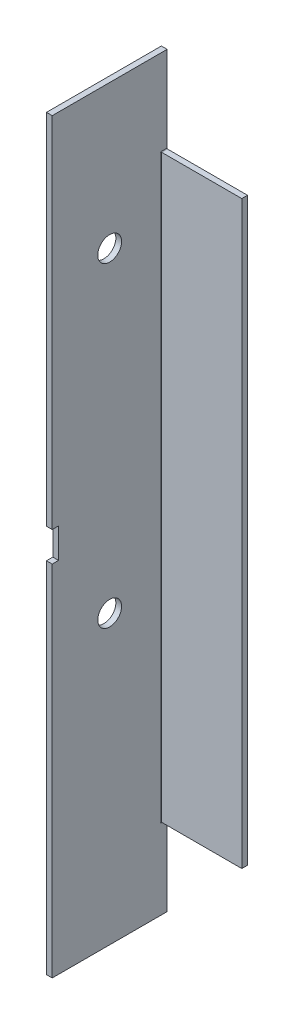
ISO-10303-21;
HEADER;
FILE_DESCRIPTION(('STEP AP214'),'2;1');
FILE_NAME('part.step','',(''),(''),'','','');
FILE_SCHEMA(('AUTOMOTIVE_DESIGN { 1 0 10303 214 1 1 1 1 }'));
ENDSEC;
DATA;
#1=APPLICATION_CONTEXT('core data for automotive mechanical design processes');
#2=APPLICATION_PROTOCOL_DEFINITION('international standard','automotive_design',2000,#1);
#3=PRODUCT_CONTEXT('',#1,'mechanical');
#4=PRODUCT('Part','Part','',(#3));
#5=PRODUCT_RELATED_PRODUCT_CATEGORY('part','',(#4));
#6=PRODUCT_DEFINITION_FORMATION('','',#4);
#7=PRODUCT_DEFINITION_CONTEXT('part definition',#1,'design');
#8=PRODUCT_DEFINITION('design','',#6,#7);
#9=PRODUCT_DEFINITION_SHAPE('','',#8);
#10=(LENGTH_UNIT() NAMED_UNIT(*) SI_UNIT(.MILLI.,.METRE.));
#11=(NAMED_UNIT(*) PLANE_ANGLE_UNIT() SI_UNIT($,.RADIAN.));
#12=(NAMED_UNIT(*) SI_UNIT($,.STERADIAN.) SOLID_ANGLE_UNIT());
#13=UNCERTAINTY_MEASURE_WITH_UNIT(LENGTH_MEASURE(1.E-05),#10,'distance_accuracy_value','');
#14=(GEOMETRIC_REPRESENTATION_CONTEXT(3) GLOBAL_UNCERTAINTY_ASSIGNED_CONTEXT((#13)) GLOBAL_UNIT_ASSIGNED_CONTEXT((#10,
#11,#12)) REPRESENTATION_CONTEXT('',''));
#15=CARTESIAN_POINT('',(0.,0.,0.));
#16=DIRECTION('',(0.,0.,1.));
#17=DIRECTION('',(1.,0.,0.));
#18=AXIS2_PLACEMENT_3D('',#15,#16,#17);
#19=CARTESIAN_POINT('',(-470.,150.,1307.83530989849));
#20=DIRECTION('',(1.,0.,0.));
#21=DIRECTION('',(0.,0.,-1.));
#22=AXIS2_PLACEMENT_3D('',#19,#20,#21);
#23=PLANE('',#22);
#24=DIRECTION('',(0.,-1.,0.));
#25=VECTOR('',#24,1.);
#26=CARTESIAN_POINT('',(-470.,150.,900.));
#27=LINE('',#26,#25);
#28=CARTESIAN_POINT('',(-470.,150.,900.));
#29=VERTEX_POINT('',#28);
#30=CARTESIAN_POINT('',(-470.,-52.0000000000001,900.));
#31=VERTEX_POINT('',#30);
#32=EDGE_CURVE('E232',#29,#31,#27,.T.);
#33=ORIENTED_EDGE('',*,*,#32,.F.);
#34=DIRECTION('',(0.,0.,-1.));
#35=VECTOR('',#34,1.);
#36=CARTESIAN_POINT('',(-470.,150.,1307.83530989849));
#37=LINE('',#36,#35);
#38=CARTESIAN_POINT('',(-470.,150.,902.));
#39=VERTEX_POINT('',#38);
#40=EDGE_CURVE('E12',#39,#29,#37,.T.);
#41=ORIENTED_EDGE('',*,*,#40,.F.);
#42=DIRECTION('',(0.,-1.,0.));
#43=VECTOR('',#42,1.);
#44=CARTESIAN_POINT('',(-470.,150.,902.));
#45=LINE('',#44,#43);
#46=CARTESIAN_POINT('',(-470.,-52.0000000000001,902.));
#47=VERTEX_POINT('',#46);
#48=EDGE_CURVE('E68',#39,#47,#45,.T.);
#49=ORIENTED_EDGE('',*,*,#48,.T.);
#50=DIRECTION('',(0.,0.,-1.));
#51=VECTOR('',#50,1.);
#52=CARTESIAN_POINT('',(-470.,-52.0000000000001,1307.83530989849));
#53=LINE('',#52,#51);
#54=EDGE_CURVE('E596',#47,#31,#53,.T.);
#55=ORIENTED_EDGE('',*,*,#54,.T.);
#56=EDGE_LOOP('',(#33,#41,#49,#55));
#57=FACE_BOUND('',#56,.T.);
#58=ADVANCED_FACE('F47',(#57),#23,.T.);
#59=CARTESIAN_POINT('',(-470.,-52.0000000000001,1307.83530989849));
#60=DIRECTION('',(0.,-1.,0.));
#61=DIRECTION('',(1.,0.,0.));
#62=AXIS2_PLACEMENT_3D('',#59,#60,#61);
#63=PLANE('',#62);
#64=DIRECTION('',(-1.,0.,0.));
#65=VECTOR('',#64,1.);
#66=CARTESIAN_POINT('',(-470.,-52.0000000000001,900.));
#67=LINE('',#66,#65);
#68=CARTESIAN_POINT('',(-497.9,-52.0000000000001,900.));
#69=VERTEX_POINT('',#68);
#70=EDGE_CURVE('E89',#31,#69,#67,.T.);
#71=ORIENTED_EDGE('',*,*,#70,.F.);
#72=ORIENTED_EDGE('',*,*,#54,.F.);
#73=DIRECTION('',(-1.,0.,0.));
#74=VECTOR('',#73,1.);
#75=CARTESIAN_POINT('',(-470.,-52.0000000000001,902.));
#76=LINE('',#75,#74);
#77=CARTESIAN_POINT('',(-497.9,-52.0000000000001,902.));
#78=VERTEX_POINT('',#77);
#79=EDGE_CURVE('E226',#47,#78,#76,.T.);
#80=ORIENTED_EDGE('',*,*,#79,.T.);
#81=DIRECTION('',(0.,0.,-1.));
#82=VECTOR('',#81,1.);
#83=CARTESIAN_POINT('',(-497.9,-52.0000000000001,1307.83530989849));
#84=LINE('',#83,#82);
#85=EDGE_CURVE('E217',#78,#69,#84,.T.);
#86=ORIENTED_EDGE('',*,*,#85,.T.);
#87=EDGE_LOOP('',(#71,#72,#80,#86));
#88=FACE_BOUND('',#87,.T.);
#89=ADVANCED_FACE('F225',(#88),#63,.T.);
#90=CARTESIAN_POINT('',(-500.,150.,900.));
#91=DIRECTION('',(0.,0.,1.));
#92=DIRECTION('',(1.,0.,0.));
#93=AXIS2_PLACEMENT_3D('',#90,#91,#92);
#94=PLANE('',#93);
#95=ORIENTED_EDGE('',*,*,#70,.T.);
#96=DIRECTION('',(0.,1.,0.));
#97=VECTOR('',#96,1.);
#98=CARTESIAN_POINT('',(-497.9,-52.0000000000001,900.));
#99=LINE('',#98,#97);
#100=CARTESIAN_POINT('',(-497.9,150.,900.));
#101=VERTEX_POINT('',#100);
#102=EDGE_CURVE('E204',#69,#101,#99,.T.);
#103=ORIENTED_EDGE('',*,*,#102,.T.);
#104=DIRECTION('',(1.,0.,0.));
#105=VECTOR('',#104,1.);
#106=CARTESIAN_POINT('',(-500.,150.,900.));
#107=LINE('',#106,#105);
#108=EDGE_CURVE('E213',#101,#29,#107,.T.);
#109=ORIENTED_EDGE('',*,*,#108,.T.);
#110=ORIENTED_EDGE('',*,*,#32,.T.);
#111=EDGE_LOOP('',(#95,#103,#109,#110));
#112=FACE_BOUND('',#111,.T.);
#113=ADVANCED_FACE('F230',(#112),#94,.F.);
#114=CARTESIAN_POINT('',(-500.,150.,1307.83530989849));
#115=DIRECTION('',(0.,1.,0.));
#116=DIRECTION('',(-1.,0.,0.));
#117=AXIS2_PLACEMENT_3D('',#114,#115,#116);
#118=PLANE('',#117);
#119=ORIENTED_EDGE('',*,*,#108,.F.);
#120=DIRECTION('',(0.,0.,-1.));
#121=VECTOR('',#120,1.);
#122=CARTESIAN_POINT('',(-497.9,150.,1307.83530989849));
#123=LINE('',#122,#121);
#124=CARTESIAN_POINT('',(-497.9,150.,902.));
#125=VERTEX_POINT('',#124);
#126=EDGE_CURVE('E522',#125,#101,#123,.T.);
#127=ORIENTED_EDGE('',*,*,#126,.F.);
#128=DIRECTION('',(1.,0.,0.));
#129=VECTOR('',#128,1.);
#130=CARTESIAN_POINT('',(-500.,150.,902.));
#131=LINE('',#130,#129);
#132=EDGE_CURVE('E59',#125,#39,#131,.T.);
#133=ORIENTED_EDGE('',*,*,#132,.T.);
#134=ORIENTED_EDGE('',*,*,#40,.T.);
#135=EDGE_LOOP('',(#119,#127,#133,#134));
#136=FACE_BOUND('',#135,.T.);
#137=ADVANCED_FACE('F589',(#136),#118,.T.);
#138=CARTESIAN_POINT('',(-500.,150.,902.));
#139=DIRECTION('',(0.,0.,1.));
#140=DIRECTION('',(1.,0.,0.));
#141=AXIS2_PLACEMENT_3D('',#138,#139,#140);
#142=PLANE('',#141);
#143=DIRECTION('',(0.,1.,0.));
#144=VECTOR('',#143,1.);
#145=CARTESIAN_POINT('',(-497.9,-52.0000000000001,902.));
#146=LINE('',#145,#144);
#147=EDGE_CURVE('E51',#78,#125,#146,.T.);
#148=ORIENTED_EDGE('',*,*,#147,.F.);
#149=ORIENTED_EDGE('',*,*,#79,.F.);
#150=ORIENTED_EDGE('',*,*,#48,.F.);
#151=ORIENTED_EDGE('',*,*,#132,.F.);
#152=EDGE_LOOP('',(#148,#149,#150,#151));
#153=FACE_BOUND('',#152,.T.);
#154=ADVANCED_FACE('F49',(#153),#142,.T.);
#155=CARTESIAN_POINT('',(-500.,180.,940.));
#156=DIRECTION('',(1.,0.,0.));
#157=DIRECTION('',(0.,0.,-1.));
#158=AXIS2_PLACEMENT_3D('',#155,#156,#157);
#159=PLANE('',#158);
#160=CARTESIAN_POINT('',(-500.,20.,920.));
#161=DIRECTION('',(1.,0.,0.));
#162=DIRECTION('',(0.,0.,-1.));
#163=AXIS2_PLACEMENT_3D('',#160,#161,#162);
#164=CIRCLE('',#163,4.15);
#165=CARTESIAN_POINT('',(-500.,20.,915.85));
#166=VERTEX_POINT('',#165);
#167=EDGE_CURVE('E356',#166,#166,#164,.F.);
#168=ORIENTED_EDGE('',*,*,#167,.F.);
#169=EDGE_LOOP('',(#168));
#170=FACE_BOUND('',#169,.T.);
#171=CARTESIAN_POINT('',(-500.,130.,920.));
#172=DIRECTION('',(1.,0.,0.));
#173=DIRECTION('',(0.,0.,-1.));
#174=AXIS2_PLACEMENT_3D('',#171,#172,#173);
#175=CIRCLE('',#174,4.15);
#176=CARTESIAN_POINT('',(-500.,130.,915.85));
#177=VERTEX_POINT('',#176);
#178=EDGE_CURVE('E363',#177,#177,#175,.F.);
#179=ORIENTED_EDGE('',*,*,#178,.F.);
#180=EDGE_LOOP('',(#179));
#181=FACE_BOUND('',#180,.T.);
#182=DIRECTION('',(0.,1.,0.));
#183=VECTOR('',#182,1.);
#184=CARTESIAN_POINT('',(-500.,-52.0000000000001,902.1));
#185=LINE('',#184,#183);
#186=CARTESIAN_POINT('',(-500.,-52.0000000000001,902.1));
#187=VERTEX_POINT('',#186);
#188=CARTESIAN_POINT('',(-500.,150.,902.1));
#189=VERTEX_POINT('',#188);
#190=EDGE_CURVE('E314',#187,#189,#185,.T.);
#191=ORIENTED_EDGE('',*,*,#190,.F.);
#192=DIRECTION('',(0.,0.,-1.));
#193=VECTOR('',#192,1.);
#194=CARTESIAN_POINT('',(-500.,-52.,940.000000000001));
#195=LINE('',#194,#193);
#196=CARTESIAN_POINT('',(-500.,-52.0000000000001,902.3));
#197=VERTEX_POINT('',#196);
#198=EDGE_CURVE('E372',#197,#187,#195,.T.);
#199=ORIENTED_EDGE('',*,*,#198,.F.);
#200=DIRECTION('',(0.,1.,0.));
#201=VECTOR('',#200,1.);
#202=CARTESIAN_POINT('',(-500.,180.,902.299999999999));
#203=LINE('',#202,#201);
#204=CARTESIAN_POINT('',(-500.,-52.2000000000001,902.3));
#205=VERTEX_POINT('',#204);
#206=EDGE_CURVE('E455',#205,#197,#203,.T.);
#207=ORIENTED_EDGE('',*,*,#206,.F.);
#208=DIRECTION('',(0.,0.,1.));
#209=VECTOR('',#208,1.);
#210=CARTESIAN_POINT('',(-500.,-52.2,940.000000000001));
#211=LINE('',#210,#209);
#212=CARTESIAN_POINT('',(-500.,-52.2000000000001,900.));
#213=VERTEX_POINT('',#212);
#214=EDGE_CURVE('E450',#213,#205,#211,.T.);
#215=ORIENTED_EDGE('',*,*,#214,.F.);
#216=DIRECTION('',(0.,1.,0.));
#217=VECTOR('',#216,1.);
#218=CARTESIAN_POINT('',(-500.,150.,900.));
#219=LINE('',#218,#217);
#220=CARTESIAN_POINT('',(-500.,-80.,899.999999999977));
#221=VERTEX_POINT('',#220);
#222=EDGE_CURVE('E454',#221,#213,#219,.T.);
#223=ORIENTED_EDGE('',*,*,#222,.F.);
#224=DIRECTION('',(0.,0.,-1.));
#225=VECTOR('',#224,1.);
#226=CARTESIAN_POINT('',(-500.,-80.0000000000001,940.));
#227=LINE('',#226,#225);
#228=CARTESIAN_POINT('',(-500.,-80.,940.));
#229=VERTEX_POINT('',#228);
#230=EDGE_CURVE('E459',#229,#221,#227,.T.);
#231=ORIENTED_EDGE('',*,*,#230,.F.);
#232=DIRECTION('',(0.,-1.,0.));
#233=VECTOR('',#232,1.);
#234=CARTESIAN_POINT('',(-500.,180.,940.));
#235=LINE('',#234,#233);
#236=CARTESIAN_POINT('',(-500.,44.8,940.));
#237=VERTEX_POINT('',#236);
#238=EDGE_CURVE('E473',#237,#229,#235,.T.);
#239=ORIENTED_EDGE('',*,*,#238,.F.);
#240=DIRECTION('',(0.,0.,-1.));
#241=VECTOR('',#240,1.);
#242=CARTESIAN_POINT('',(-500.,44.8,940.2));
#243=LINE('',#242,#241);
#244=CARTESIAN_POINT('',(-500.,44.8,937.8));
#245=VERTEX_POINT('',#244);
#246=EDGE_CURVE('E477',#237,#245,#243,.T.);
#247=ORIENTED_EDGE('',*,*,#246,.T.);
#248=DIRECTION('',(0.,-1.,0.));
#249=VECTOR('',#248,1.);
#250=CARTESIAN_POINT('',(-500.,44.8,937.8));
#251=LINE('',#250,#249);
#252=CARTESIAN_POINT('',(-500.,55.2,937.8));
#253=VERTEX_POINT('',#252);
#254=EDGE_CURVE('E547',#253,#245,#251,.T.);
#255=ORIENTED_EDGE('',*,*,#254,.F.);
#256=DIRECTION('',(0.,0.,-1.));
#257=VECTOR('',#256,1.);
#258=CARTESIAN_POINT('',(-500.,55.2,940.2));
#259=LINE('',#258,#257);
#260=CARTESIAN_POINT('',(-500.,55.2,940.));
#261=VERTEX_POINT('',#260);
#262=EDGE_CURVE('E493',#261,#253,#259,.T.);
#263=ORIENTED_EDGE('',*,*,#262,.F.);
#264=CARTESIAN_POINT('',(-500.,180.,940.));
#265=VERTEX_POINT('',#264);
#266=EDGE_CURVE('E478',#265,#261,#235,.T.);
#267=ORIENTED_EDGE('',*,*,#266,.F.);
#268=DIRECTION('',(0.,0.,1.));
#269=VECTOR('',#268,1.);
#270=CARTESIAN_POINT('',(-500.,180.,940.));
#271=LINE('',#270,#269);
#272=CARTESIAN_POINT('',(-500.,180.,900.));
#273=VERTEX_POINT('',#272);
#274=EDGE_CURVE('E488',#273,#265,#271,.T.);
#275=ORIENTED_EDGE('',*,*,#274,.F.);
#276=CARTESIAN_POINT('',(-500.,150.2,900.));
#277=VERTEX_POINT('',#276);
#278=EDGE_CURVE('E373',#277,#273,#219,.T.);
#279=ORIENTED_EDGE('',*,*,#278,.F.);
#280=DIRECTION('',(0.,0.,-1.));
#281=VECTOR('',#280,1.);
#282=CARTESIAN_POINT('',(-500.,150.2,940.));
#283=LINE('',#282,#281);
#284=CARTESIAN_POINT('',(-500.,150.2,902.3));
#285=VERTEX_POINT('',#284);
#286=EDGE_CURVE('E495',#285,#277,#283,.T.);
#287=ORIENTED_EDGE('',*,*,#286,.F.);
#288=DIRECTION('',(0.,1.,0.));
#289=VECTOR('',#288,1.);
#290=CARTESIAN_POINT('',(-500.,180.,902.3));
#291=LINE('',#290,#289);
#292=CARTESIAN_POINT('',(-500.,150.,902.3));
#293=VERTEX_POINT('',#292);
#294=EDGE_CURVE('E499',#293,#285,#291,.T.);
#295=ORIENTED_EDGE('',*,*,#294,.F.);
#296=DIRECTION('',(0.,0.,1.));
#297=VECTOR('',#296,1.);
#298=CARTESIAN_POINT('',(-500.,150.,940.));
#299=LINE('',#298,#297);
#300=EDGE_CURVE('E367',#189,#293,#299,.T.);
#301=ORIENTED_EDGE('',*,*,#300,.F.);
#302=EDGE_LOOP('',(#191,#199,#207,#215,#223,#231,#239,#247,#255,#263,#267,#275,#279,#287,#295,#301));
#303=FACE_BOUND('',#302,.T.);
#304=ADVANCED_FACE('F515',(#170,#181,#303),#159,.F.);
#305=CARTESIAN_POINT('',(-498.,-178.,-49.114696339176));
#306=DIRECTION('',(1.,0.,0.));
#307=DIRECTION('',(0.,0.,-1.));
#308=AXIS2_PLACEMENT_3D('',#305,#306,#307);
#309=PLANE('',#308);
#310=CARTESIAN_POINT('',(-498.,20.,920.));
#311=DIRECTION('',(1.,0.,0.));
#312=DIRECTION('',(0.,0.,-1.));
#313=AXIS2_PLACEMENT_3D('',#310,#311,#312);
#314=CIRCLE('',#313,4.15);
#315=CARTESIAN_POINT('',(-498.,20.,915.85));
#316=VERTEX_POINT('',#315);
#317=EDGE_CURVE('E336',#316,#316,#314,.T.);
#318=ORIENTED_EDGE('',*,*,#317,.F.);
#319=EDGE_LOOP('',(#318));
#320=FACE_BOUND('',#319,.T.);
#321=CARTESIAN_POINT('',(-498.,130.,920.));
#322=DIRECTION('',(1.,0.,0.));
#323=DIRECTION('',(0.,0.,-1.));
#324=AXIS2_PLACEMENT_3D('',#321,#322,#323);
#325=CIRCLE('',#324,4.15);
#326=CARTESIAN_POINT('',(-498.,130.,915.85));
#327=VERTEX_POINT('',#326);
#328=EDGE_CURVE('E341',#327,#327,#325,.T.);
#329=ORIENTED_EDGE('',*,*,#328,.F.);
#330=EDGE_LOOP('',(#329));
#331=FACE_BOUND('',#330,.T.);
#332=DIRECTION('',(0.,0.,-1.));
#333=VECTOR('',#332,1.);
#334=CARTESIAN_POINT('',(-498.,-52.0000000000034,-49.1146963391765));
#335=LINE('',#334,#333);
#336=CARTESIAN_POINT('',(-498.,-52.0000000000001,902.3));
#337=VERTEX_POINT('',#336);
#338=CARTESIAN_POINT('',(-498.,-52.0000000000001,902.1));
#339=VERTEX_POINT('',#338);
#340=EDGE_CURVE('E351',#337,#339,#335,.T.);
#341=ORIENTED_EDGE('',*,*,#340,.T.);
#342=DIRECTION('',(0.,1.,0.));
#343=VECTOR('',#342,1.);
#344=CARTESIAN_POINT('',(-498.,-52.0000000000001,902.1));
#345=LINE('',#344,#343);
#346=CARTESIAN_POINT('',(-498.,150.,902.1));
#347=VERTEX_POINT('',#346);
#348=EDGE_CURVE('E318',#339,#347,#345,.T.);
#349=ORIENTED_EDGE('',*,*,#348,.T.);
#350=DIRECTION('',(0.,0.,1.));
#351=VECTOR('',#350,1.);
#352=CARTESIAN_POINT('',(-498.,150.,-49.114696339176));
#353=LINE('',#352,#351);
#354=CARTESIAN_POINT('',(-498.,150.,902.3));
#355=VERTEX_POINT('',#354);
#356=EDGE_CURVE('E382',#347,#355,#353,.T.);
#357=ORIENTED_EDGE('',*,*,#356,.T.);
#358=DIRECTION('',(0.,1.,0.));
#359=VECTOR('',#358,1.);
#360=CARTESIAN_POINT('',(-498.,-178.,902.3));
#361=LINE('',#360,#359);
#362=CARTESIAN_POINT('',(-498.,150.2,902.3));
#363=VERTEX_POINT('',#362);
#364=EDGE_CURVE('E97',#355,#363,#361,.T.);
#365=ORIENTED_EDGE('',*,*,#364,.T.);
#366=DIRECTION('',(0.,0.,-1.));
#367=VECTOR('',#366,1.);
#368=CARTESIAN_POINT('',(-498.,150.2,-49.114696339176));
#369=LINE('',#368,#367);
#370=CARTESIAN_POINT('',(-498.,150.2,900.));
#371=VERTEX_POINT('',#370);
#372=EDGE_CURVE('E105',#363,#371,#369,.T.);
#373=ORIENTED_EDGE('',*,*,#372,.T.);
#374=DIRECTION('',(0.,1.,0.));
#375=VECTOR('',#374,1.);
#376=CARTESIAN_POINT('',(-498.,150.,900.));
#377=LINE('',#376,#375);
#378=CARTESIAN_POINT('',(-498.,180.,900.));
#379=VERTEX_POINT('',#378);
#380=EDGE_CURVE('E392',#371,#379,#377,.T.);
#381=ORIENTED_EDGE('',*,*,#380,.T.);
#382=DIRECTION('',(0.,0.,1.));
#383=VECTOR('',#382,1.);
#384=CARTESIAN_POINT('',(-498.,180.,0.));
#385=LINE('',#384,#383);
#386=CARTESIAN_POINT('',(-498.,180.,940.));
#387=VERTEX_POINT('',#386);
#388=EDGE_CURVE('E400',#379,#387,#385,.T.);
#389=ORIENTED_EDGE('',*,*,#388,.T.);
#390=DIRECTION('',(0.,-1.,0.));
#391=VECTOR('',#390,1.);
#392=CARTESIAN_POINT('',(-498.,180.,940.));
#393=LINE('',#392,#391);
#394=CARTESIAN_POINT('',(-498.,55.1999999999999,940.));
#395=VERTEX_POINT('',#394);
#396=EDGE_CURVE('E404',#387,#395,#393,.T.);
#397=ORIENTED_EDGE('',*,*,#396,.T.);
#398=DIRECTION('',(0.,0.,-1.));
#399=VECTOR('',#398,1.);
#400=CARTESIAN_POINT('',(-498.,55.2,940.2));
#401=LINE('',#400,#399);
#402=CARTESIAN_POINT('',(-498.,55.2,937.8));
#403=VERTEX_POINT('',#402);
#404=EDGE_CURVE('E409',#395,#403,#401,.T.);
#405=ORIENTED_EDGE('',*,*,#404,.T.);
#406=DIRECTION('',(0.,1.,0.));
#407=VECTOR('',#406,1.);
#408=CARTESIAN_POINT('',(-498.,44.8,937.8));
#409=LINE('',#408,#407);
#410=CARTESIAN_POINT('',(-498.,44.8,937.8));
#411=VERTEX_POINT('',#410);
#412=EDGE_CURVE('E531',#411,#403,#409,.T.);
#413=ORIENTED_EDGE('',*,*,#412,.F.);
#414=DIRECTION('',(0.,0.,-1.));
#415=VECTOR('',#414,1.);
#416=CARTESIAN_POINT('',(-498.,44.8,940.2));
#417=LINE('',#416,#415);
#418=CARTESIAN_POINT('',(-498.,44.8,940.));
#419=VERTEX_POINT('',#418);
#420=EDGE_CURVE('E427',#419,#411,#417,.T.);
#421=ORIENTED_EDGE('',*,*,#420,.F.);
#422=CARTESIAN_POINT('',(-498.,-80.0000000000001,940.));
#423=VERTEX_POINT('',#422);
#424=EDGE_CURVE('E410',#419,#423,#393,.T.);
#425=ORIENTED_EDGE('',*,*,#424,.T.);
#426=DIRECTION('',(0.,0.,-1.));
#427=VECTOR('',#426,1.);
#428=CARTESIAN_POINT('',(-498.,-80.0000000000001,-1733.32780110116));
#429=LINE('',#428,#427);
#430=CARTESIAN_POINT('',(-498.,-80.0000000000001,899.999999999977));
#431=VERTEX_POINT('',#430);
#432=EDGE_CURVE('E422',#423,#431,#429,.T.);
#433=ORIENTED_EDGE('',*,*,#432,.T.);
#434=DIRECTION('',(0.,1.,0.));
#435=VECTOR('',#434,1.);
#436=CARTESIAN_POINT('',(-498.,-178.,900.));
#437=LINE('',#436,#435);
#438=CARTESIAN_POINT('',(-498.,-52.2000000000001,900.));
#439=VERTEX_POINT('',#438);
#440=EDGE_CURVE('E426',#431,#439,#437,.T.);
#441=ORIENTED_EDGE('',*,*,#440,.T.);
#442=DIRECTION('',(0.,0.,1.));
#443=VECTOR('',#442,1.);
#444=CARTESIAN_POINT('',(-498.,-52.2000000000034,-49.1146963391765));
#445=LINE('',#444,#443);
#446=CARTESIAN_POINT('',(-498.,-52.2000000000001,902.3));
#447=VERTEX_POINT('',#446);
#448=EDGE_CURVE('E432',#439,#447,#445,.T.);
#449=ORIENTED_EDGE('',*,*,#448,.T.);
#450=DIRECTION('',(0.,1.,0.));
#451=VECTOR('',#450,1.);
#452=CARTESIAN_POINT('',(-498.,-177.999999999997,902.3));
#453=LINE('',#452,#451);
#454=EDGE_CURVE('E357',#447,#337,#453,.T.);
#455=ORIENTED_EDGE('',*,*,#454,.T.);
#456=EDGE_LOOP('',(#341,#349,#357,#365,#373,#381,#389,#397,#405,#413,#421,#425,#433,#441,#449,#455));
#457=FACE_BOUND('',#456,.T.);
#458=ADVANCED_FACE('F439',(#320,#331,#457),#309,.T.);
#459=CARTESIAN_POINT('',(-500.,130.,920.));
#460=DIRECTION('',(-1.,0.,0.));
#461=DIRECTION('',(0.,0.,1.));
#462=AXIS2_PLACEMENT_3D('',#459,#460,#461);
#463=CYLINDRICAL_SURFACE('',#462,4.15);
#464=ORIENTED_EDGE('',*,*,#178,.T.);
#465=EDGE_LOOP('',(#464));
#466=FACE_BOUND('',#465,.T.);
#467=ORIENTED_EDGE('',*,*,#328,.T.);
#468=EDGE_LOOP('',(#467));
#469=FACE_BOUND('',#468,.T.);
#470=ADVANCED_FACE('F614',(#466,#469),#463,.F.);
#471=CARTESIAN_POINT('',(-500.,20.,920.));
#472=DIRECTION('',(-1.,0.,0.));
#473=DIRECTION('',(0.,0.,1.));
#474=AXIS2_PLACEMENT_3D('',#471,#472,#473);
#475=CYLINDRICAL_SURFACE('',#474,4.15);
#476=ORIENTED_EDGE('',*,*,#167,.T.);
#477=EDGE_LOOP('',(#476));
#478=FACE_BOUND('',#477,.T.);
#479=ORIENTED_EDGE('',*,*,#317,.T.);
#480=EDGE_LOOP('',(#479));
#481=FACE_BOUND('',#480,.T.);
#482=ADVANCED_FACE('F621',(#478,#481),#475,.F.);
#483=CARTESIAN_POINT('',(26.1178575186434,-52.0000000000034,-49.1146963391765));
#484=DIRECTION('',(0.,1.,0.));
#485=DIRECTION('',(0.,0.,1.));
#486=AXIS2_PLACEMENT_3D('',#483,#484,#485);
#487=PLANE('',#486);
#488=DIRECTION('',(-1.,0.,0.));
#489=VECTOR('',#488,1.);
#490=CARTESIAN_POINT('',(26.1178575186434,-52.0000000000001,902.3));
#491=LINE('',#490,#489);
#492=EDGE_CURVE('E310',#337,#197,#491,.T.);
#493=ORIENTED_EDGE('',*,*,#492,.T.);
#494=ORIENTED_EDGE('',*,*,#198,.T.);
#495=DIRECTION('',(-1.,0.,0.));
#496=VECTOR('',#495,1.);
#497=CARTESIAN_POINT('',(26.1178575186434,-52.0000000000001,902.1));
#498=LINE('',#497,#496);
#499=EDGE_CURVE('E220',#339,#187,#498,.T.);
#500=ORIENTED_EDGE('',*,*,#499,.F.);
#501=ORIENTED_EDGE('',*,*,#340,.F.);
#502=EDGE_LOOP('',(#493,#494,#500,#501));
#503=FACE_BOUND('',#502,.T.);
#504=ADVANCED_FACE('F512',(#503),#487,.F.);
#505=CARTESIAN_POINT('',(26.1178575186434,150.,-49.114696339176));
#506=DIRECTION('',(0.,-1.,0.));
#507=DIRECTION('',(0.,0.,-1.));
#508=AXIS2_PLACEMENT_3D('',#505,#506,#507);
#509=PLANE('',#508);
#510=DIRECTION('',(-1.,0.,0.));
#511=VECTOR('',#510,1.);
#512=CARTESIAN_POINT('',(26.1178575186434,150.,902.1));
#513=LINE('',#512,#511);
#514=EDGE_CURVE('E256',#347,#189,#513,.T.);
#515=ORIENTED_EDGE('',*,*,#514,.T.);
#516=ORIENTED_EDGE('',*,*,#300,.T.);
#517=DIRECTION('',(-1.,0.,0.));
#518=VECTOR('',#517,1.);
#519=CARTESIAN_POINT('',(26.1178575186434,150.,902.3));
#520=LINE('',#519,#518);
#521=EDGE_CURVE('E260',#355,#293,#520,.T.);
#522=ORIENTED_EDGE('',*,*,#521,.F.);
#523=ORIENTED_EDGE('',*,*,#356,.F.);
#524=EDGE_LOOP('',(#515,#516,#522,#523));
#525=FACE_BOUND('',#524,.T.);
#526=ADVANCED_FACE('F518',(#525),#509,.F.);
#527=CARTESIAN_POINT('',(26.1178575186434,-178.,902.3));
#528=DIRECTION('',(0.,0.,1.));
#529=DIRECTION('',(1.,0.,0.));
#530=AXIS2_PLACEMENT_3D('',#527,#528,#529);
#531=PLANE('',#530);
#532=ORIENTED_EDGE('',*,*,#521,.T.);
#533=ORIENTED_EDGE('',*,*,#294,.T.);
#534=DIRECTION('',(-1.,0.,0.));
#535=VECTOR('',#534,1.);
#536=CARTESIAN_POINT('',(26.1178575186434,150.2,902.3));
#537=LINE('',#536,#535);
#538=EDGE_CURVE('E263',#363,#285,#537,.T.);
#539=ORIENTED_EDGE('',*,*,#538,.F.);
#540=ORIENTED_EDGE('',*,*,#364,.F.);
#541=EDGE_LOOP('',(#532,#533,#539,#540));
#542=FACE_BOUND('',#541,.T.);
#543=ADVANCED_FACE('F570',(#542),#531,.F.);
#544=CARTESIAN_POINT('',(26.1178575186434,150.2,-49.114696339176));
#545=DIRECTION('',(0.,1.,0.));
#546=DIRECTION('',(0.,0.,1.));
#547=AXIS2_PLACEMENT_3D('',#544,#545,#546);
#548=PLANE('',#547);
#549=ORIENTED_EDGE('',*,*,#538,.T.);
#550=ORIENTED_EDGE('',*,*,#286,.T.);
#551=DIRECTION('',(-1.,0.,0.));
#552=VECTOR('',#551,1.);
#553=CARTESIAN_POINT('',(26.1178575186434,150.2,900.));
#554=LINE('',#553,#552);
#555=EDGE_CURVE('E266',#371,#277,#554,.T.);
#556=ORIENTED_EDGE('',*,*,#555,.F.);
#557=ORIENTED_EDGE('',*,*,#372,.F.);
#558=EDGE_LOOP('',(#549,#550,#556,#557));
#559=FACE_BOUND('',#558,.T.);
#560=ADVANCED_FACE('F569',(#559),#548,.F.);
#561=CARTESIAN_POINT('',(26.1178575186434,150.,900.));
#562=DIRECTION('',(0.,0.,1.));
#563=DIRECTION('',(1.,0.,0.));
#564=AXIS2_PLACEMENT_3D('',#561,#562,#563);
#565=PLANE('',#564);
#566=ORIENTED_EDGE('',*,*,#555,.T.);
#567=ORIENTED_EDGE('',*,*,#278,.T.);
#568=DIRECTION('',(-1.,0.,0.));
#569=VECTOR('',#568,1.);
#570=CARTESIAN_POINT('',(26.1178575186434,180.,900.));
#571=LINE('',#570,#569);
#572=EDGE_CURVE('E270',#379,#273,#571,.T.);
#573=ORIENTED_EDGE('',*,*,#572,.F.);
#574=ORIENTED_EDGE('',*,*,#380,.F.);
#575=EDGE_LOOP('',(#566,#567,#573,#574));
#576=FACE_BOUND('',#575,.T.);
#577=ADVANCED_FACE('F567',(#576),#565,.F.);
#578=CARTESIAN_POINT('',(26.1178575186434,180.,0.));
#579=DIRECTION('',(0.,-1.,0.));
#580=DIRECTION('',(0.,0.,-1.));
#581=AXIS2_PLACEMENT_3D('',#578,#579,#580);
#582=PLANE('',#581);
#583=ORIENTED_EDGE('',*,*,#572,.T.);
#584=ORIENTED_EDGE('',*,*,#274,.T.);
#585=DIRECTION('',(-1.,0.,0.));
#586=VECTOR('',#585,1.);
#587=CARTESIAN_POINT('',(26.1178575186434,180.,940.));
#588=LINE('',#587,#586);
#589=EDGE_CURVE('E274',#387,#265,#588,.T.);
#590=ORIENTED_EDGE('',*,*,#589,.F.);
#591=ORIENTED_EDGE('',*,*,#388,.F.);
#592=EDGE_LOOP('',(#583,#584,#590,#591));
#593=FACE_BOUND('',#592,.T.);
#594=ADVANCED_FACE('F563',(#593),#582,.F.);
#595=CARTESIAN_POINT('',(26.1178575186434,180.,940.));
#596=DIRECTION('',(0.,0.,-1.));
#597=DIRECTION('',(-1.,0.,0.));
#598=AXIS2_PLACEMENT_3D('',#595,#596,#597);
#599=PLANE('',#598);
#600=ORIENTED_EDGE('',*,*,#589,.T.);
#601=ORIENTED_EDGE('',*,*,#266,.T.);
#602=DIRECTION('',(-1.,0.,0.));
#603=VECTOR('',#602,1.);
#604=CARTESIAN_POINT('',(26.1178575186434,55.1999999999999,940.));
#605=LINE('',#604,#603);
#606=EDGE_CURVE('E278',#395,#261,#605,.T.);
#607=ORIENTED_EDGE('',*,*,#606,.F.);
#608=ORIENTED_EDGE('',*,*,#396,.F.);
#609=EDGE_LOOP('',(#600,#601,#607,#608));
#610=FACE_BOUND('',#609,.T.);
#611=ADVANCED_FACE('F559',(#610),#599,.F.);
#612=CARTESIAN_POINT('',(26.1178575186434,55.2,940.2));
#613=DIRECTION('',(0.,1.,0.));
#614=DIRECTION('',(0.,0.,1.));
#615=AXIS2_PLACEMENT_3D('',#612,#613,#614);
#616=PLANE('',#615);
#617=ORIENTED_EDGE('',*,*,#606,.T.);
#618=ORIENTED_EDGE('',*,*,#262,.T.);
#619=DIRECTION('',(-1.,0.,0.));
#620=VECTOR('',#619,1.);
#621=CARTESIAN_POINT('',(26.1178575186434,55.2,937.8));
#622=LINE('',#621,#620);
#623=EDGE_CURVE('E282',#403,#253,#622,.T.);
#624=ORIENTED_EDGE('',*,*,#623,.F.);
#625=ORIENTED_EDGE('',*,*,#404,.F.);
#626=EDGE_LOOP('',(#617,#618,#624,#625));
#627=FACE_BOUND('',#626,.T.);
#628=ADVANCED_FACE('F561',(#627),#616,.F.);
#629=CARTESIAN_POINT('',(26.1178575186434,44.8,937.8));
#630=DIRECTION('',(0.,0.,1.));
#631=DIRECTION('',(1.,0.,0.));
#632=AXIS2_PLACEMENT_3D('',#629,#630,#631);
#633=PLANE('',#632);
#634=ORIENTED_EDGE('',*,*,#254,.T.);
#635=DIRECTION('',(-1.,0.,0.));
#636=VECTOR('',#635,1.);
#637=CARTESIAN_POINT('',(26.1178575186434,44.8,937.8));
#638=LINE('',#637,#636);
#639=EDGE_CURVE('E286',#411,#245,#638,.T.);
#640=ORIENTED_EDGE('',*,*,#639,.F.);
#641=ORIENTED_EDGE('',*,*,#412,.T.);
#642=ORIENTED_EDGE('',*,*,#623,.T.);
#643=EDGE_LOOP('',(#634,#640,#641,#642));
#644=FACE_BOUND('',#643,.T.);
#645=ADVANCED_FACE('F641',(#644),#633,.T.);
#646=CARTESIAN_POINT('',(26.1178575186434,44.8,940.2));
#647=DIRECTION('',(0.,1.,0.));
#648=DIRECTION('',(0.,0.,1.));
#649=AXIS2_PLACEMENT_3D('',#646,#647,#648);
#650=PLANE('',#649);
#651=ORIENTED_EDGE('',*,*,#246,.F.);
#652=DIRECTION('',(-1.,0.,0.));
#653=VECTOR('',#652,1.);
#654=CARTESIAN_POINT('',(26.1178575186434,44.8,940.));
#655=LINE('',#654,#653);
#656=EDGE_CURVE('E290',#419,#237,#655,.T.);
#657=ORIENTED_EDGE('',*,*,#656,.F.);
#658=ORIENTED_EDGE('',*,*,#420,.T.);
#659=ORIENTED_EDGE('',*,*,#639,.T.);
#660=EDGE_LOOP('',(#651,#657,#658,#659));
#661=FACE_BOUND('',#660,.T.);
#662=ADVANCED_FACE('F543',(#661),#650,.T.);
#663=ORIENTED_EDGE('',*,*,#656,.T.);
#664=ORIENTED_EDGE('',*,*,#238,.T.);
#665=DIRECTION('',(-1.,0.,0.));
#666=VECTOR('',#665,1.);
#667=CARTESIAN_POINT('',(26.1178575186434,-80.0000000000001,940.));
#668=LINE('',#667,#666);
#669=EDGE_CURVE('E294',#423,#229,#668,.T.);
#670=ORIENTED_EDGE('',*,*,#669,.F.);
#671=ORIENTED_EDGE('',*,*,#424,.F.);
#672=EDGE_LOOP('',(#663,#664,#670,#671));
#673=FACE_BOUND('',#672,.T.);
#674=ADVANCED_FACE('F540',(#673),#599,.F.);
#675=CARTESIAN_POINT('',(26.1178575186434,-80.0000000000001,-1733.32780110116));
#676=DIRECTION('',(0.,1.,0.));
#677=DIRECTION('',(0.,0.,1.));
#678=AXIS2_PLACEMENT_3D('',#675,#676,#677);
#679=PLANE('',#678);
#680=ORIENTED_EDGE('',*,*,#669,.T.);
#681=ORIENTED_EDGE('',*,*,#230,.T.);
#682=DIRECTION('',(-1.,0.,0.));
#683=VECTOR('',#682,1.);
#684=CARTESIAN_POINT('',(26.1178575186434,-80.0000000000001,899.999999999977));
#685=LINE('',#684,#683);
#686=EDGE_CURVE('E298',#431,#221,#685,.T.);
#687=ORIENTED_EDGE('',*,*,#686,.F.);
#688=ORIENTED_EDGE('',*,*,#432,.F.);
#689=EDGE_LOOP('',(#680,#681,#687,#688));
#690=FACE_BOUND('',#689,.T.);
#691=ADVANCED_FACE('F632',(#690),#679,.F.);
#692=CARTESIAN_POINT('',(26.1178575186434,-178.,900.));
#693=DIRECTION('',(0.,0.,1.));
#694=DIRECTION('',(1.,0.,0.));
#695=AXIS2_PLACEMENT_3D('',#692,#693,#694);
#696=PLANE('',#695);
#697=ORIENTED_EDGE('',*,*,#686,.T.);
#698=ORIENTED_EDGE('',*,*,#222,.T.);
#699=DIRECTION('',(-1.,0.,0.));
#700=VECTOR('',#699,1.);
#701=CARTESIAN_POINT('',(26.1178575186434,-52.2000000000001,900.));
#702=LINE('',#701,#700);
#703=EDGE_CURVE('E302',#439,#213,#702,.T.);
#704=ORIENTED_EDGE('',*,*,#703,.F.);
#705=ORIENTED_EDGE('',*,*,#440,.F.);
#706=EDGE_LOOP('',(#697,#698,#704,#705));
#707=FACE_BOUND('',#706,.T.);
#708=ADVANCED_FACE('F629',(#707),#696,.F.);
#709=CARTESIAN_POINT('',(26.1178575186434,-52.2000000000034,-49.1146963391765));
#710=DIRECTION('',(0.,-1.,0.));
#711=DIRECTION('',(0.,0.,-1.));
#712=AXIS2_PLACEMENT_3D('',#709,#710,#711);
#713=PLANE('',#712);
#714=ORIENTED_EDGE('',*,*,#703,.T.);
#715=ORIENTED_EDGE('',*,*,#214,.T.);
#716=DIRECTION('',(-1.,0.,0.));
#717=VECTOR('',#716,1.);
#718=CARTESIAN_POINT('',(26.1178575186434,-52.2000000000001,902.3));
#719=LINE('',#718,#717);
#720=EDGE_CURVE('E306',#447,#205,#719,.T.);
#721=ORIENTED_EDGE('',*,*,#720,.F.);
#722=ORIENTED_EDGE('',*,*,#448,.F.);
#723=EDGE_LOOP('',(#714,#715,#721,#722));
#724=FACE_BOUND('',#723,.T.);
#725=ADVANCED_FACE('F448',(#724),#713,.F.);
#726=CARTESIAN_POINT('',(26.1178575186434,-177.999999999997,902.3));
#727=DIRECTION('',(0.,0.,1.));
#728=DIRECTION('',(0.,-1.,0.));
#729=AXIS2_PLACEMENT_3D('',#726,#727,#728);
#730=PLANE('',#729);
#731=ORIENTED_EDGE('',*,*,#720,.T.);
#732=ORIENTED_EDGE('',*,*,#206,.T.);
#733=ORIENTED_EDGE('',*,*,#492,.F.);
#734=ORIENTED_EDGE('',*,*,#454,.F.);
#735=EDGE_LOOP('',(#731,#732,#733,#734));
#736=FACE_BOUND('',#735,.T.);
#737=ADVANCED_FACE('F444',(#736),#730,.F.);
#738=CARTESIAN_POINT('',(-497.9,150.,902.1));
#739=DIRECTION('',(0.,1.,0.));
#740=DIRECTION('',(0.,0.,1.));
#741=AXIS2_PLACEMENT_3D('',#738,#739,#740);
#742=PLANE('',#741);
#743=ORIENTED_EDGE('',*,*,#514,.F.);
#744=CARTESIAN_POINT('',(-497.9,150.,902.1));
#745=DIRECTION('',(0.,1.,0.));
#746=DIRECTION('',(0.,0.,1.));
#747=AXIS2_PLACEMENT_3D('',#744,#745,#746);
#748=CIRCLE('',#747,0.100000000000046);
#749=EDGE_CURVE('E222',#347,#125,#748,.F.);
#750=ORIENTED_EDGE('',*,*,#749,.T.);
#751=ORIENTED_EDGE('',*,*,#126,.T.);
#752=CARTESIAN_POINT('',(-497.9,150.,902.1));
#753=DIRECTION('',(0.,1.,0.));
#754=DIRECTION('',(0.,0.,1.));
#755=AXIS2_PLACEMENT_3D('',#752,#753,#754);
#756=CIRCLE('',#755,2.10000000000005);
#757=EDGE_CURVE('E82',#189,#101,#756,.F.);
#758=ORIENTED_EDGE('',*,*,#757,.F.);
#759=EDGE_LOOP('',(#743,#750,#751,#758));
#760=FACE_BOUND('',#759,.T.);
#761=ADVANCED_FACE('F520',(#760),#742,.T.);
#762=CARTESIAN_POINT('',(-497.9,-52.0000000000001,902.1));
#763=DIRECTION('',(0.,-1.,0.));
#764=DIRECTION('',(0.,0.,-1.));
#765=AXIS2_PLACEMENT_3D('',#762,#763,#764);
#766=PLANE('',#765);
#767=ORIENTED_EDGE('',*,*,#85,.F.);
#768=CARTESIAN_POINT('',(-497.9,-52.0000000000001,902.1));
#769=DIRECTION('',(0.,1.,0.));
#770=DIRECTION('',(0.,0.,1.));
#771=AXIS2_PLACEMENT_3D('',#768,#769,#770);
#772=CIRCLE('',#771,0.100000000000046);
#773=EDGE_CURVE('E328',#78,#339,#772,.T.);
#774=ORIENTED_EDGE('',*,*,#773,.T.);
#775=ORIENTED_EDGE('',*,*,#499,.T.);
#776=CARTESIAN_POINT('',(-497.9,-52.0000000000001,902.1));
#777=DIRECTION('',(0.,1.,0.));
#778=DIRECTION('',(0.,0.,1.));
#779=AXIS2_PLACEMENT_3D('',#776,#777,#778);
#780=CIRCLE('',#779,2.10000000000005);
#781=EDGE_CURVE('E207',#69,#187,#780,.T.);
#782=ORIENTED_EDGE('',*,*,#781,.F.);
#783=EDGE_LOOP('',(#767,#774,#775,#782));
#784=FACE_BOUND('',#783,.T.);
#785=ADVANCED_FACE('F216',(#784),#766,.T.);
#786=CARTESIAN_POINT('',(-497.9,-320.401862884743,902.1));
#787=DIRECTION('',(0.,1.,0.));
#788=DIRECTION('',(0.,0.,1.));
#789=AXIS2_PLACEMENT_3D('',#786,#787,#788);
#790=CYLINDRICAL_SURFACE('',#789,2.10000000000005);
#791=ORIENTED_EDGE('',*,*,#781,.T.);
#792=ORIENTED_EDGE('',*,*,#190,.T.);
#793=ORIENTED_EDGE('',*,*,#757,.T.);
#794=ORIENTED_EDGE('',*,*,#102,.F.);
#795=EDGE_LOOP('',(#791,#792,#793,#794));
#796=FACE_BOUND('',#795,.T.);
#797=ADVANCED_FACE('F206',(#796),#790,.T.);
#798=CARTESIAN_POINT('',(-497.9,-320.401862884743,902.1));
#799=DIRECTION('',(0.,1.,0.));
#800=DIRECTION('',(0.,0.,1.));
#801=AXIS2_PLACEMENT_3D('',#798,#799,#800);
#802=CYLINDRICAL_SURFACE('',#801,0.100000000000046);
#803=ORIENTED_EDGE('',*,*,#773,.F.);
#804=ORIENTED_EDGE('',*,*,#147,.T.);
#805=ORIENTED_EDGE('',*,*,#749,.F.);
#806=ORIENTED_EDGE('',*,*,#348,.F.);
#807=EDGE_LOOP('',(#803,#804,#805,#806));
#808=FACE_BOUND('',#807,.T.);
#809=ADVANCED_FACE('F507',(#808),#802,.F.);
#810=CLOSED_SHELL('',(#58,#89,#113,#137,#154,#304,#458,#470,#482,#504,#526,#543,#560,#577,#594,
#611,#628,#645,#662,#674,#691,#708,#725,#737,#761,#785,#797,#809));
#811=MANIFOLD_SOLID_BREP('B2',#810);
#812=ADVANCED_BREP_SHAPE_REPRESENTATION('',(#18,#811),#14);
#813=SHAPE_DEFINITION_REPRESENTATION(#9,#812);
ENDSEC;
END-ISO-10303-21;
